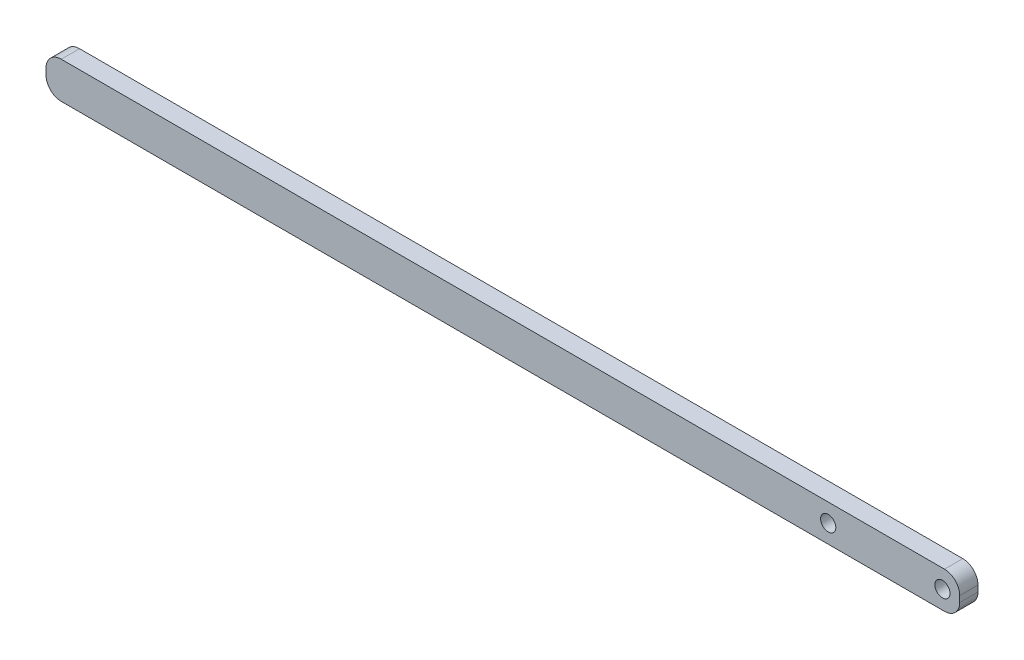
ISO-10303-21;
HEADER;
FILE_DESCRIPTION(('STEP AP214'),'2;1');
FILE_NAME('part.step','',(''),(''),'','','');
FILE_SCHEMA(('AUTOMOTIVE_DESIGN { 1 0 10303 214 1 1 1 1 }'));
ENDSEC;
DATA;
#1=APPLICATION_CONTEXT('core data for automotive mechanical design processes');
#2=APPLICATION_PROTOCOL_DEFINITION('international standard','automotive_design',2000,#1);
#3=PRODUCT_CONTEXT('',#1,'mechanical');
#4=PRODUCT('Part','Part','',(#3));
#5=PRODUCT_RELATED_PRODUCT_CATEGORY('part','',(#4));
#6=PRODUCT_DEFINITION_FORMATION('','',#4);
#7=PRODUCT_DEFINITION_CONTEXT('part definition',#1,'design');
#8=PRODUCT_DEFINITION('design','',#6,#7);
#9=PRODUCT_DEFINITION_SHAPE('','',#8);
#10=(LENGTH_UNIT() NAMED_UNIT(*) SI_UNIT(.MILLI.,.METRE.));
#11=(NAMED_UNIT(*) PLANE_ANGLE_UNIT() SI_UNIT($,.RADIAN.));
#12=(NAMED_UNIT(*) SI_UNIT($,.STERADIAN.) SOLID_ANGLE_UNIT());
#13=UNCERTAINTY_MEASURE_WITH_UNIT(LENGTH_MEASURE(1.E-05),#10,'distance_accuracy_value','');
#14=(GEOMETRIC_REPRESENTATION_CONTEXT(3) GLOBAL_UNCERTAINTY_ASSIGNED_CONTEXT((#13)) GLOBAL_UNIT_ASSIGNED_CONTEXT((#10,
#11,#12)) REPRESENTATION_CONTEXT('',''));
#15=CARTESIAN_POINT('',(0.,0.,0.));
#16=DIRECTION('',(0.,0.,1.));
#17=DIRECTION('',(1.,0.,0.));
#18=AXIS2_PLACEMENT_3D('',#15,#16,#17);
#19=CARTESIAN_POINT('',(150.,6.,6.));
#20=DIRECTION('',(-1.,0.,0.));
#21=DIRECTION('',(0.,0.,1.));
#22=AXIS2_PLACEMENT_3D('',#19,#20,#21);
#23=PLANE('',#22);
#24=DIRECTION('',(0.,1.,0.));
#25=VECTOR('',#24,1.);
#26=CARTESIAN_POINT('',(150.,6.,6.));
#27=LINE('',#26,#25);
#28=CARTESIAN_POINT('',(150.,-1.,6.));
#29=VERTEX_POINT('',#28);
#30=CARTESIAN_POINT('',(150.,1.,6.));
#31=VERTEX_POINT('',#30);
#32=EDGE_CURVE('E126',#29,#31,#27,.T.);
#33=ORIENTED_EDGE('',*,*,#32,.F.);
#34=DIRECTION('',(0.,0.,-1.));
#35=VECTOR('',#34,1.);
#36=CARTESIAN_POINT('',(150.,-1.,6.));
#37=LINE('',#36,#35);
#38=CARTESIAN_POINT('',(150.,-1.,0.));
#39=VERTEX_POINT('',#38);
#40=EDGE_CURVE('E152',#29,#39,#37,.T.);
#41=ORIENTED_EDGE('',*,*,#40,.T.);
#42=DIRECTION('',(0.,1.,0.));
#43=VECTOR('',#42,1.);
#44=CARTESIAN_POINT('',(150.,6.,0.));
#45=LINE('',#44,#43);
#46=CARTESIAN_POINT('',(150.,1.,0.));
#47=VERTEX_POINT('',#46);
#48=EDGE_CURVE('E212',#39,#47,#45,.T.);
#49=ORIENTED_EDGE('',*,*,#48,.T.);
#50=DIRECTION('',(0.,0.,-1.));
#51=VECTOR('',#50,1.);
#52=CARTESIAN_POINT('',(150.,1.,6.));
#53=LINE('',#52,#51);
#54=EDGE_CURVE('E150',#47,#31,#53,.F.);
#55=ORIENTED_EDGE('',*,*,#54,.T.);
#56=EDGE_LOOP('',(#33,#41,#49,#55));
#57=FACE_BOUND('',#56,.T.);
#58=ADVANCED_FACE('F33',(#57),#23,.F.);
#59=CARTESIAN_POINT('',(-150.,6.,6.));
#60=DIRECTION('',(0.,-1.,0.));
#61=DIRECTION('',(0.,0.,-1.));
#62=AXIS2_PLACEMENT_3D('',#59,#60,#61);
#63=PLANE('',#62);
#64=DIRECTION('',(-1.,0.,0.));
#65=VECTOR('',#64,1.);
#66=CARTESIAN_POINT('',(-150.,6.,6.));
#67=LINE('',#66,#65);
#68=CARTESIAN_POINT('',(145.,6.,6.));
#69=VERTEX_POINT('',#68);
#70=CARTESIAN_POINT('',(-145.,6.,6.));
#71=VERTEX_POINT('',#70);
#72=EDGE_CURVE('E129',#69,#71,#67,.T.);
#73=ORIENTED_EDGE('',*,*,#72,.F.);
#74=DIRECTION('',(0.,0.,-1.));
#75=VECTOR('',#74,1.);
#76=CARTESIAN_POINT('',(145.,6.,6.));
#77=LINE('',#76,#75);
#78=CARTESIAN_POINT('',(145.,6.,0.));
#79=VERTEX_POINT('',#78);
#80=EDGE_CURVE('E156',#69,#79,#77,.T.);
#81=ORIENTED_EDGE('',*,*,#80,.T.);
#82=DIRECTION('',(-1.,0.,0.));
#83=VECTOR('',#82,1.);
#84=CARTESIAN_POINT('',(-150.,6.,0.));
#85=LINE('',#84,#83);
#86=CARTESIAN_POINT('',(-145.,6.,0.));
#87=VERTEX_POINT('',#86);
#88=EDGE_CURVE('E131',#79,#87,#85,.T.);
#89=ORIENTED_EDGE('',*,*,#88,.T.);
#90=DIRECTION('',(0.,0.,-1.));
#91=VECTOR('',#90,1.);
#92=CARTESIAN_POINT('',(-145.,6.,6.));
#93=LINE('',#92,#91);
#94=EDGE_CURVE('E48',#87,#71,#93,.F.);
#95=ORIENTED_EDGE('',*,*,#94,.T.);
#96=EDGE_LOOP('',(#73,#81,#89,#95));
#97=FACE_BOUND('',#96,.T.);
#98=ADVANCED_FACE('F174',(#97),#63,.F.);
#99=CARTESIAN_POINT('',(-150.,6.,6.));
#100=DIRECTION('',(1.,0.,0.));
#101=DIRECTION('',(0.,0.,-1.));
#102=AXIS2_PLACEMENT_3D('',#99,#100,#101);
#103=PLANE('',#102);
#104=DIRECTION('',(0.,-1.,0.));
#105=VECTOR('',#104,1.);
#106=CARTESIAN_POINT('',(-150.,6.,0.));
#107=LINE('',#106,#105);
#108=CARTESIAN_POINT('',(-150.,1.,0.));
#109=VERTEX_POINT('',#108);
#110=CARTESIAN_POINT('',(-150.,-1.,0.));
#111=VERTEX_POINT('',#110);
#112=EDGE_CURVE('E127',#109,#111,#107,.T.);
#113=ORIENTED_EDGE('',*,*,#112,.T.);
#114=DIRECTION('',(0.,0.,-1.));
#115=VECTOR('',#114,1.);
#116=CARTESIAN_POINT('',(-150.,-1.,6.));
#117=LINE('',#116,#115);
#118=CARTESIAN_POINT('',(-150.,-1.,6.));
#119=VERTEX_POINT('',#118);
#120=EDGE_CURVE('E105',#111,#119,#117,.F.);
#121=ORIENTED_EDGE('',*,*,#120,.T.);
#122=DIRECTION('',(0.,-1.,0.));
#123=VECTOR('',#122,1.);
#124=CARTESIAN_POINT('',(-150.,6.,6.));
#125=LINE('',#124,#123);
#126=CARTESIAN_POINT('',(-150.,1.,6.));
#127=VERTEX_POINT('',#126);
#128=EDGE_CURVE('E206',#127,#119,#125,.T.);
#129=ORIENTED_EDGE('',*,*,#128,.F.);
#130=DIRECTION('',(0.,0.,-1.));
#131=VECTOR('',#130,1.);
#132=CARTESIAN_POINT('',(-150.,1.,6.));
#133=LINE('',#132,#131);
#134=EDGE_CURVE('E110',#127,#109,#133,.T.);
#135=ORIENTED_EDGE('',*,*,#134,.T.);
#136=EDGE_LOOP('',(#113,#121,#129,#135));
#137=FACE_BOUND('',#136,.T.);
#138=ADVANCED_FACE('F180',(#137),#103,.F.);
#139=CARTESIAN_POINT('',(-150.,-6.,6.));
#140=DIRECTION('',(0.,1.,0.));
#141=DIRECTION('',(0.,0.,1.));
#142=AXIS2_PLACEMENT_3D('',#139,#140,#141);
#143=PLANE('',#142);
#144=DIRECTION('',(1.,0.,0.));
#145=VECTOR('',#144,1.);
#146=CARTESIAN_POINT('',(-150.,-6.,6.));
#147=LINE('',#146,#145);
#148=CARTESIAN_POINT('',(-145.,-6.,6.));
#149=VERTEX_POINT('',#148);
#150=CARTESIAN_POINT('',(145.,-6.,6.));
#151=VERTEX_POINT('',#150);
#152=EDGE_CURVE('E120',#149,#151,#147,.T.);
#153=ORIENTED_EDGE('',*,*,#152,.F.);
#154=DIRECTION('',(0.,0.,-1.));
#155=VECTOR('',#154,1.);
#156=CARTESIAN_POINT('',(-145.,-6.,6.));
#157=LINE('',#156,#155);
#158=CARTESIAN_POINT('',(-145.,-6.,0.));
#159=VERTEX_POINT('',#158);
#160=EDGE_CURVE('E104',#149,#159,#157,.T.);
#161=ORIENTED_EDGE('',*,*,#160,.T.);
#162=DIRECTION('',(1.,0.,0.));
#163=VECTOR('',#162,1.);
#164=CARTESIAN_POINT('',(-150.,-6.,0.));
#165=LINE('',#164,#163);
#166=CARTESIAN_POINT('',(145.,-6.,0.));
#167=VERTEX_POINT('',#166);
#168=EDGE_CURVE('E117',#159,#167,#165,.T.);
#169=ORIENTED_EDGE('',*,*,#168,.T.);
#170=DIRECTION('',(0.,0.,-1.));
#171=VECTOR('',#170,1.);
#172=CARTESIAN_POINT('',(145.,-6.,6.));
#173=LINE('',#172,#171);
#174=EDGE_CURVE('E122',#167,#151,#173,.F.);
#175=ORIENTED_EDGE('',*,*,#174,.T.);
#176=EDGE_LOOP('',(#153,#161,#169,#175));
#177=FACE_BOUND('',#176,.T.);
#178=ADVANCED_FACE('F116',(#177),#143,.F.);
#179=CARTESIAN_POINT('',(0.,0.,6.));
#180=DIRECTION('',(0.,0.,1.));
#181=DIRECTION('',(1.,0.,0.));
#182=AXIS2_PLACEMENT_3D('',#179,#180,#181);
#183=PLANE('',#182);
#184=CARTESIAN_POINT('',(106.82263712,0.,6.));
#185=DIRECTION('',(0.,0.,-1.));
#186=DIRECTION('',(-1.,0.,0.));
#187=AXIS2_PLACEMENT_3D('',#184,#185,#186);
#188=CIRCLE('',#187,2.50000000000001);
#189=CARTESIAN_POINT('',(104.32263712,0.,6.));
#190=VERTEX_POINT('',#189);
#191=EDGE_CURVE('E221',#190,#190,#188,.T.);
#192=ORIENTED_EDGE('',*,*,#191,.T.);
#193=EDGE_LOOP('',(#192));
#194=FACE_BOUND('',#193,.T.);
#195=CARTESIAN_POINT('',(144.32263712,0.,6.));
#196=DIRECTION('',(0.,0.,-1.));
#197=DIRECTION('',(-1.,0.,0.));
#198=AXIS2_PLACEMENT_3D('',#195,#196,#197);
#199=CIRCLE('',#198,2.50000000000002);
#200=CARTESIAN_POINT('',(141.82263712,0.,6.));
#201=VERTEX_POINT('',#200);
#202=EDGE_CURVE('E214',#201,#201,#199,.T.);
#203=ORIENTED_EDGE('',*,*,#202,.T.);
#204=EDGE_LOOP('',(#203));
#205=FACE_BOUND('',#204,.T.);
#206=ORIENTED_EDGE('',*,*,#128,.T.);
#207=CARTESIAN_POINT('',(-145.,-1.,6.));
#208=DIRECTION('',(0.,0.,1.));
#209=DIRECTION('',(1.,0.,0.));
#210=AXIS2_PLACEMENT_3D('',#207,#208,#209);
#211=CIRCLE('',#210,5.);
#212=EDGE_CURVE('E148',#119,#149,#211,.T.);
#213=ORIENTED_EDGE('',*,*,#212,.T.);
#214=ORIENTED_EDGE('',*,*,#152,.T.);
#215=CARTESIAN_POINT('',(145.,-1.,6.));
#216=DIRECTION('',(0.,0.,1.));
#217=DIRECTION('',(1.,0.,0.));
#218=AXIS2_PLACEMENT_3D('',#215,#216,#217);
#219=CIRCLE('',#218,5.);
#220=EDGE_CURVE('E146',#151,#29,#219,.T.);
#221=ORIENTED_EDGE('',*,*,#220,.T.);
#222=ORIENTED_EDGE('',*,*,#32,.T.);
#223=CARTESIAN_POINT('',(145.,1.,6.));
#224=DIRECTION('',(0.,0.,1.));
#225=DIRECTION('',(1.,0.,0.));
#226=AXIS2_PLACEMENT_3D('',#223,#224,#225);
#227=CIRCLE('',#226,5.);
#228=EDGE_CURVE('E55',#31,#69,#227,.T.);
#229=ORIENTED_EDGE('',*,*,#228,.T.);
#230=ORIENTED_EDGE('',*,*,#72,.T.);
#231=CARTESIAN_POINT('',(-145.,1.,6.));
#232=DIRECTION('',(0.,0.,1.));
#233=DIRECTION('',(1.,0.,0.));
#234=AXIS2_PLACEMENT_3D('',#231,#232,#233);
#235=CIRCLE('',#234,5.);
#236=EDGE_CURVE('E143',#71,#127,#235,.T.);
#237=ORIENTED_EDGE('',*,*,#236,.T.);
#238=EDGE_LOOP('',(#206,#213,#214,#221,#222,#229,#230,#237));
#239=FACE_BOUND('',#238,.T.);
#240=ADVANCED_FACE('F205',(#194,#205,#239),#183,.T.);
#241=CARTESIAN_POINT('',(0.,0.,0.));
#242=DIRECTION('',(0.,0.,1.));
#243=DIRECTION('',(1.,0.,0.));
#244=AXIS2_PLACEMENT_3D('',#241,#242,#243);
#245=PLANE('',#244);
#246=CARTESIAN_POINT('',(144.32263712,0.,0.));
#247=DIRECTION('',(0.,0.,1.));
#248=DIRECTION('',(1.,0.,0.));
#249=AXIS2_PLACEMENT_3D('',#246,#247,#248);
#250=CIRCLE('',#249,3.49999999999998);
#251=CARTESIAN_POINT('',(147.82263712,0.,0.));
#252=VERTEX_POINT('',#251);
#253=EDGE_CURVE('E11',#252,#252,#250,.T.);
#254=ORIENTED_EDGE('',*,*,#253,.T.);
#255=EDGE_LOOP('',(#254));
#256=FACE_BOUND('',#255,.T.);
#257=CARTESIAN_POINT('',(106.82263712,0.,0.));
#258=DIRECTION('',(0.,0.,-1.));
#259=DIRECTION('',(-1.,0.,0.));
#260=AXIS2_PLACEMENT_3D('',#257,#258,#259);
#261=CIRCLE('',#260,2.50000000000001);
#262=CARTESIAN_POINT('',(104.32263712,0.,0.));
#263=VERTEX_POINT('',#262);
#264=EDGE_CURVE('E226',#263,#263,#261,.T.);
#265=ORIENTED_EDGE('',*,*,#264,.F.);
#266=EDGE_LOOP('',(#265));
#267=FACE_BOUND('',#266,.T.);
#268=ORIENTED_EDGE('',*,*,#168,.F.);
#269=CARTESIAN_POINT('',(-145.,-1.,0.));
#270=DIRECTION('',(0.,0.,1.));
#271=DIRECTION('',(1.,0.,0.));
#272=AXIS2_PLACEMENT_3D('',#269,#270,#271);
#273=CIRCLE('',#272,5.);
#274=EDGE_CURVE('E100',#159,#111,#273,.F.);
#275=ORIENTED_EDGE('',*,*,#274,.T.);
#276=ORIENTED_EDGE('',*,*,#112,.F.);
#277=CARTESIAN_POINT('',(-145.,1.,0.));
#278=DIRECTION('',(0.,0.,1.));
#279=DIRECTION('',(1.,0.,0.));
#280=AXIS2_PLACEMENT_3D('',#277,#278,#279);
#281=CIRCLE('',#280,5.);
#282=EDGE_CURVE('E121',#109,#87,#281,.F.);
#283=ORIENTED_EDGE('',*,*,#282,.T.);
#284=ORIENTED_EDGE('',*,*,#88,.F.);
#285=CARTESIAN_POINT('',(145.,1.,0.));
#286=DIRECTION('',(0.,0.,1.));
#287=DIRECTION('',(1.,0.,0.));
#288=AXIS2_PLACEMENT_3D('',#285,#286,#287);
#289=CIRCLE('',#288,5.);
#290=EDGE_CURVE('E137',#79,#47,#289,.F.);
#291=ORIENTED_EDGE('',*,*,#290,.T.);
#292=ORIENTED_EDGE('',*,*,#48,.F.);
#293=CARTESIAN_POINT('',(145.,-1.,0.));
#294=DIRECTION('',(0.,0.,1.));
#295=DIRECTION('',(1.,0.,0.));
#296=AXIS2_PLACEMENT_3D('',#293,#294,#295);
#297=CIRCLE('',#296,5.);
#298=EDGE_CURVE('E111',#39,#167,#297,.F.);
#299=ORIENTED_EDGE('',*,*,#298,.T.);
#300=EDGE_LOOP('',(#268,#275,#276,#283,#284,#291,#292,#299));
#301=FACE_BOUND('',#300,.T.);
#302=ADVANCED_FACE('F124',(#256,#267,#301),#245,.F.);
#303=CARTESIAN_POINT('',(-145.,-1.,6.));
#304=DIRECTION('',(0.,0.,-1.));
#305=DIRECTION('',(-1.,0.,0.));
#306=AXIS2_PLACEMENT_3D('',#303,#304,#305);
#307=CYLINDRICAL_SURFACE('',#306,5.);
#308=ORIENTED_EDGE('',*,*,#212,.F.);
#309=ORIENTED_EDGE('',*,*,#120,.F.);
#310=ORIENTED_EDGE('',*,*,#274,.F.);
#311=ORIENTED_EDGE('',*,*,#160,.F.);
#312=EDGE_LOOP('',(#308,#309,#310,#311));
#313=FACE_BOUND('',#312,.T.);
#314=ADVANCED_FACE('F103',(#313),#307,.T.);
#315=CARTESIAN_POINT('',(145.,-1.,6.));
#316=DIRECTION('',(0.,0.,-1.));
#317=DIRECTION('',(-1.,0.,0.));
#318=AXIS2_PLACEMENT_3D('',#315,#316,#317);
#319=CYLINDRICAL_SURFACE('',#318,5.);
#320=ORIENTED_EDGE('',*,*,#220,.F.);
#321=ORIENTED_EDGE('',*,*,#174,.F.);
#322=ORIENTED_EDGE('',*,*,#298,.F.);
#323=ORIENTED_EDGE('',*,*,#40,.F.);
#324=EDGE_LOOP('',(#320,#321,#322,#323));
#325=FACE_BOUND('',#324,.T.);
#326=ADVANCED_FACE('F187',(#325),#319,.T.);
#327=CARTESIAN_POINT('',(145.,1.,6.));
#328=DIRECTION('',(0.,0.,-1.));
#329=DIRECTION('',(-1.,0.,0.));
#330=AXIS2_PLACEMENT_3D('',#327,#328,#329);
#331=CYLINDRICAL_SURFACE('',#330,5.);
#332=ORIENTED_EDGE('',*,*,#228,.F.);
#333=ORIENTED_EDGE('',*,*,#54,.F.);
#334=ORIENTED_EDGE('',*,*,#290,.F.);
#335=ORIENTED_EDGE('',*,*,#80,.F.);
#336=EDGE_LOOP('',(#332,#333,#334,#335));
#337=FACE_BOUND('',#336,.T.);
#338=ADVANCED_FACE('F190',(#337),#331,.T.);
#339=CARTESIAN_POINT('',(-145.,1.,6.));
#340=DIRECTION('',(0.,0.,-1.));
#341=DIRECTION('',(-1.,0.,0.));
#342=AXIS2_PLACEMENT_3D('',#339,#340,#341);
#343=CYLINDRICAL_SURFACE('',#342,5.);
#344=ORIENTED_EDGE('',*,*,#236,.F.);
#345=ORIENTED_EDGE('',*,*,#94,.F.);
#346=ORIENTED_EDGE('',*,*,#282,.F.);
#347=ORIENTED_EDGE('',*,*,#134,.F.);
#348=EDGE_LOOP('',(#344,#345,#346,#347));
#349=FACE_BOUND('',#348,.T.);
#350=ADVANCED_FACE('F193',(#349),#343,.T.);
#351=CARTESIAN_POINT('',(144.32263712,0.,6.));
#352=DIRECTION('',(0.,0.,-1.));
#353=DIRECTION('',(-1.,0.,0.));
#354=AXIS2_PLACEMENT_3D('',#351,#352,#353);
#355=CYLINDRICAL_SURFACE('',#354,2.50000000000002);
#356=CARTESIAN_POINT('',(144.32263712,0.,0.999999999999931));
#357=DIRECTION('',(0.,0.,1.));
#358=DIRECTION('',(1.,0.,0.));
#359=AXIS2_PLACEMENT_3D('',#356,#357,#358);
#360=CIRCLE('',#359,2.50000000000002);
#361=CARTESIAN_POINT('',(146.82263712,0.,0.999999999999931));
#362=VERTEX_POINT('',#361);
#363=EDGE_CURVE('E41',#362,#362,#360,.F.);
#364=ORIENTED_EDGE('',*,*,#363,.T.);
#365=EDGE_LOOP('',(#364));
#366=FACE_BOUND('',#365,.T.);
#367=ORIENTED_EDGE('',*,*,#202,.F.);
#368=EDGE_LOOP('',(#367));
#369=FACE_BOUND('',#368,.T.);
#370=ADVANCED_FACE('F161',(#366,#369),#355,.F.);
#371=CARTESIAN_POINT('',(106.82263712,0.,6.));
#372=DIRECTION('',(0.,0.,-1.));
#373=DIRECTION('',(-1.,0.,0.));
#374=AXIS2_PLACEMENT_3D('',#371,#372,#373);
#375=CYLINDRICAL_SURFACE('',#374,2.50000000000001);
#376=ORIENTED_EDGE('',*,*,#191,.F.);
#377=EDGE_LOOP('',(#376));
#378=FACE_BOUND('',#377,.T.);
#379=ORIENTED_EDGE('',*,*,#264,.T.);
#380=EDGE_LOOP('',(#379));
#381=FACE_BOUND('',#380,.T.);
#382=ADVANCED_FACE('F165',(#378,#381),#375,.F.);
#383=CARTESIAN_POINT('',(144.32263712,0.,0.999999999999931));
#384=DIRECTION('',(0.,0.,-1.));
#385=DIRECTION('',(-1.,0.,0.));
#386=AXIS2_PLACEMENT_3D('',#383,#384,#385);
#387=CONICAL_SURFACE('',#386,2.50000000000002,0.785398163397458);
#388=ORIENTED_EDGE('',*,*,#253,.F.);
#389=EDGE_LOOP('',(#388));
#390=FACE_BOUND('',#389,.T.);
#391=ORIENTED_EDGE('',*,*,#363,.F.);
#392=EDGE_LOOP('',(#391));
#393=FACE_BOUND('',#392,.T.);
#394=ADVANCED_FACE('F35',(#390,#393),#387,.F.);
#395=CLOSED_SHELL('',(#58,#98,#138,#178,#240,#302,#314,#326,#338,#350,#370,#382,#394));
#396=MANIFOLD_SOLID_BREP('B2',#395);
#397=ADVANCED_BREP_SHAPE_REPRESENTATION('',(#18,#396),#14);
#398=SHAPE_DEFINITION_REPRESENTATION(#9,#397);
ENDSEC;
END-ISO-10303-21;
